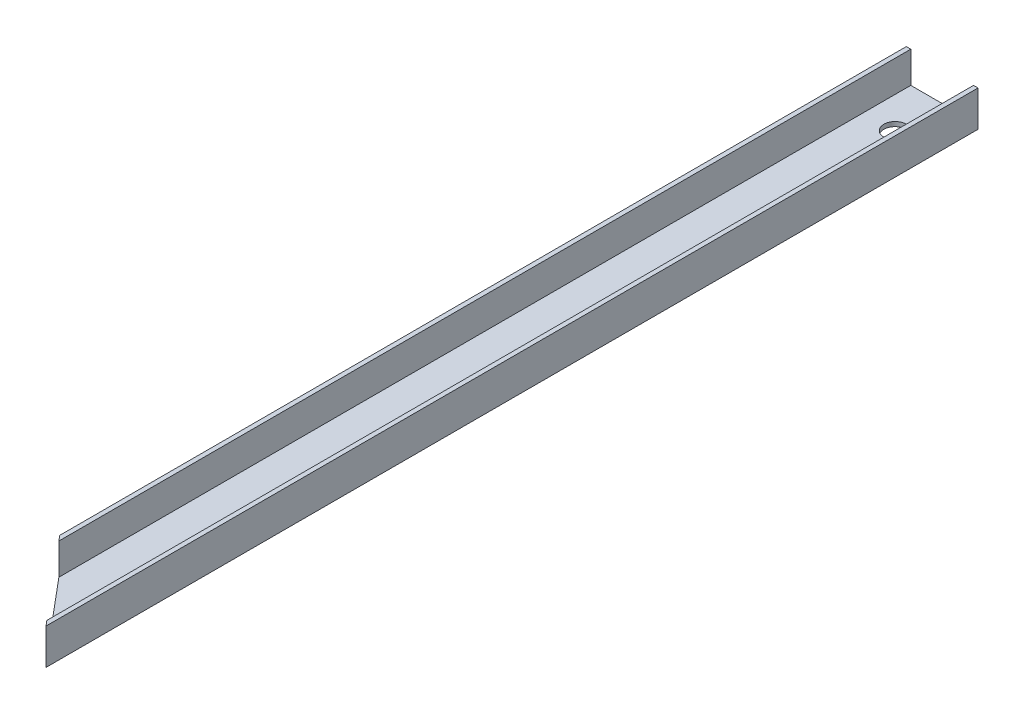
ISO-10303-21;
HEADER;
FILE_DESCRIPTION(('STEP AP214'),'2;1');
FILE_NAME('part.step','',(''),(''),'','','');
FILE_SCHEMA(('AUTOMOTIVE_DESIGN { 1 0 10303 214 1 1 1 1 }'));
ENDSEC;
DATA;
#1=APPLICATION_CONTEXT('core data for automotive mechanical design processes');
#2=APPLICATION_PROTOCOL_DEFINITION('international standard','automotive_design',2000,#1);
#3=PRODUCT_CONTEXT('',#1,'mechanical');
#4=PRODUCT('Part','Part','',(#3));
#5=PRODUCT_RELATED_PRODUCT_CATEGORY('part','',(#4));
#6=PRODUCT_DEFINITION_FORMATION('','',#4);
#7=PRODUCT_DEFINITION_CONTEXT('part definition',#1,'design');
#8=PRODUCT_DEFINITION('design','',#6,#7);
#9=PRODUCT_DEFINITION_SHAPE('','',#8);
#10=(LENGTH_UNIT() NAMED_UNIT(*) SI_UNIT(.MILLI.,.METRE.));
#11=(NAMED_UNIT(*) PLANE_ANGLE_UNIT() SI_UNIT($,.RADIAN.));
#12=(NAMED_UNIT(*) SI_UNIT($,.STERADIAN.) SOLID_ANGLE_UNIT());
#13=UNCERTAINTY_MEASURE_WITH_UNIT(LENGTH_MEASURE(1.E-05),#10,'distance_accuracy_value','');
#14=(GEOMETRIC_REPRESENTATION_CONTEXT(3) GLOBAL_UNCERTAINTY_ASSIGNED_CONTEXT((#13)) GLOBAL_UNIT_ASSIGNED_CONTEXT((#10,
#11,#12)) REPRESENTATION_CONTEXT('',''));
#15=CARTESIAN_POINT('',(0.,0.,0.));
#16=DIRECTION('',(0.,0.,1.));
#17=DIRECTION('',(1.,0.,0.));
#18=AXIS2_PLACEMENT_3D('',#15,#16,#17);
#19=CARTESIAN_POINT('',(-22.225,-9.525,660.4));
#20=DIRECTION('',(0.,-1.,0.));
#21=DIRECTION('',(0.,0.,-1.));
#22=AXIS2_PLACEMENT_3D('',#19,#20,#21);
#23=PLANE('',#22);
#24=CARTESIAN_POINT('',(0.,-9.525,33.3375));
#25=DIRECTION('',(0.,-1.,0.));
#26=DIRECTION('',(0.,0.,-1.));
#27=AXIS2_PLACEMENT_3D('',#24,#25,#26);
#28=CIRCLE('',#27,7.9375);
#29=CARTESIAN_POINT('',(0.,-9.525,25.4));
#30=VERTEX_POINT('',#29);
#31=EDGE_CURVE('E178',#30,#30,#28,.F.);
#32=ORIENTED_EDGE('',*,*,#31,.F.);
#33=EDGE_LOOP('',(#32));
#34=FACE_BOUND('',#33,.T.);
#35=DIRECTION('',(0.,0.,-1.));
#36=VECTOR('',#35,1.);
#37=CARTESIAN_POINT('',(-22.225,-9.525,660.4));
#38=LINE('',#37,#36);
#39=CARTESIAN_POINT('',(-22.225,-9.525,603.642735152701));
#40=VERTEX_POINT('',#39);
#41=CARTESIAN_POINT('',(-22.225,-9.525,0.));
#42=VERTEX_POINT('',#41);
#43=EDGE_CURVE('E11',#40,#42,#38,.T.);
#44=ORIENTED_EDGE('',*,*,#43,.F.);
#45=DIRECTION('',(0.642787609686543,0.,0.766044443118975));
#46=VECTOR('',#45,1.);
#47=CARTESIAN_POINT('',(5.72249723069354,-9.525,636.949265381397));
#48=LINE('',#47,#46);
#49=CARTESIAN_POINT('',(22.225,-9.525,656.616182343513));
#50=VERTEX_POINT('',#49);
#51=EDGE_CURVE('E167',#40,#50,#48,.T.);
#52=ORIENTED_EDGE('',*,*,#51,.T.);
#53=DIRECTION('',(0.,0.,-1.));
#54=VECTOR('',#53,1.);
#55=CARTESIAN_POINT('',(22.225,-9.525,660.4));
#56=LINE('',#55,#54);
#57=CARTESIAN_POINT('',(22.225,-9.525,0.));
#58=VERTEX_POINT('',#57);
#59=EDGE_CURVE('E89',#50,#58,#56,.T.);
#60=ORIENTED_EDGE('',*,*,#59,.T.);
#61=DIRECTION('',(-1.,0.,0.));
#62=VECTOR('',#61,1.);
#63=CARTESIAN_POINT('',(-22.225,-9.525,0.));
#64=LINE('',#63,#62);
#65=EDGE_CURVE('E103',#58,#42,#64,.T.);
#66=ORIENTED_EDGE('',*,*,#65,.T.);
#67=EDGE_LOOP('',(#44,#52,#60,#66));
#68=FACE_BOUND('',#67,.T.);
#69=ADVANCED_FACE('F32',(#34,#68),#23,.F.);
#70=CARTESIAN_POINT('',(-22.225,-9.525,660.4));
#71=DIRECTION('',(-1.,0.,0.));
#72=DIRECTION('',(0.,0.,1.));
#73=AXIS2_PLACEMENT_3D('',#70,#71,#72);
#74=PLANE('',#73);
#75=DIRECTION('',(0.,0.,-1.));
#76=VECTOR('',#75,1.);
#77=CARTESIAN_POINT('',(-22.225,12.7,660.4));
#78=LINE('',#77,#76);
#79=CARTESIAN_POINT('',(-22.225,12.7,603.642735152701));
#80=VERTEX_POINT('',#79);
#81=CARTESIAN_POINT('',(-22.225,12.7,0.));
#82=VERTEX_POINT('',#81);
#83=EDGE_CURVE('E40',#80,#82,#78,.T.);
#84=ORIENTED_EDGE('',*,*,#83,.F.);
#85=DIRECTION('',(0.,-1.,0.));
#86=VECTOR('',#85,1.);
#87=CARTESIAN_POINT('',(-22.225,-9.525,603.642735152701));
#88=LINE('',#87,#86);
#89=EDGE_CURVE('E169',#80,#40,#88,.T.);
#90=ORIENTED_EDGE('',*,*,#89,.T.);
#91=ORIENTED_EDGE('',*,*,#43,.T.);
#92=DIRECTION('',(0.,1.,0.));
#93=VECTOR('',#92,1.);
#94=CARTESIAN_POINT('',(-22.225,-9.525,0.));
#95=LINE('',#94,#93);
#96=EDGE_CURVE('E132',#42,#82,#95,.T.);
#97=ORIENTED_EDGE('',*,*,#96,.T.);
#98=EDGE_LOOP('',(#84,#90,#91,#97));
#99=FACE_BOUND('',#98,.T.);
#100=ADVANCED_FACE('F133',(#99),#74,.F.);
#101=CARTESIAN_POINT('',(-25.4,12.7,660.4));
#102=DIRECTION('',(0.,-1.,0.));
#103=DIRECTION('',(0.,0.,-1.));
#104=AXIS2_PLACEMENT_3D('',#101,#102,#103);
#105=PLANE('',#104);
#106=DIRECTION('',(0.,0.,-1.));
#107=VECTOR('',#106,1.);
#108=CARTESIAN_POINT('',(-25.4,12.7,660.4));
#109=LINE('',#108,#107);
#110=CARTESIAN_POINT('',(-25.4,12.7,599.858917496215));
#111=VERTEX_POINT('',#110);
#112=CARTESIAN_POINT('',(-25.4,12.7,0.));
#113=VERTEX_POINT('',#112);
#114=EDGE_CURVE('E116',#111,#113,#109,.T.);
#115=ORIENTED_EDGE('',*,*,#114,.F.);
#116=DIRECTION('',(0.642787609686543,0.,0.766044443118975));
#117=VECTOR('',#116,1.);
#118=CARTESIAN_POINT('',(25.4,12.7,660.4));
#119=LINE('',#118,#117);
#120=EDGE_CURVE('E129',#111,#80,#119,.T.);
#121=ORIENTED_EDGE('',*,*,#120,.T.);
#122=ORIENTED_EDGE('',*,*,#83,.T.);
#123=DIRECTION('',(-1.,0.,0.));
#124=VECTOR('',#123,1.);
#125=CARTESIAN_POINT('',(-25.4,12.7,0.));
#126=LINE('',#125,#124);
#127=EDGE_CURVE('E125',#82,#113,#126,.T.);
#128=ORIENTED_EDGE('',*,*,#127,.T.);
#129=EDGE_LOOP('',(#115,#121,#122,#128));
#130=FACE_BOUND('',#129,.T.);
#131=ADVANCED_FACE('F123',(#130),#105,.F.);
#132=CARTESIAN_POINT('',(-25.4,-12.7,660.4));
#133=DIRECTION('',(1.,0.,0.));
#134=DIRECTION('',(0.,1.,0.));
#135=AXIS2_PLACEMENT_3D('',#132,#133,#134);
#136=PLANE('',#135);
#137=DIRECTION('',(0.,0.,-1.));
#138=VECTOR('',#137,1.);
#139=CARTESIAN_POINT('',(-25.4,-12.7,660.4));
#140=LINE('',#139,#138);
#141=CARTESIAN_POINT('',(-25.4,-12.7,599.858917496215));
#142=VERTEX_POINT('',#141);
#143=CARTESIAN_POINT('',(-25.4,-12.7,0.));
#144=VERTEX_POINT('',#143);
#145=EDGE_CURVE('E114',#142,#144,#140,.T.);
#146=ORIENTED_EDGE('',*,*,#145,.F.);
#147=DIRECTION('',(0.,-1.,0.));
#148=VECTOR('',#147,1.);
#149=CARTESIAN_POINT('',(-25.4,12.7,599.858917496215));
#150=LINE('',#149,#148);
#151=EDGE_CURVE('E156',#111,#142,#150,.T.);
#152=ORIENTED_EDGE('',*,*,#151,.F.);
#153=ORIENTED_EDGE('',*,*,#114,.T.);
#154=DIRECTION('',(0.,-1.,0.));
#155=VECTOR('',#154,1.);
#156=CARTESIAN_POINT('',(-25.4,-12.7,0.));
#157=LINE('',#156,#155);
#158=EDGE_CURVE('E138',#113,#144,#157,.T.);
#159=ORIENTED_EDGE('',*,*,#158,.T.);
#160=EDGE_LOOP('',(#146,#152,#153,#159));
#161=FACE_BOUND('',#160,.T.);
#162=ADVANCED_FACE('F154',(#161),#136,.F.);
#163=CARTESIAN_POINT('',(-25.4,-12.7,660.4));
#164=DIRECTION('',(0.,1.,0.));
#165=DIRECTION('',(-1.,0.,0.));
#166=AXIS2_PLACEMENT_3D('',#163,#164,#165);
#167=PLANE('',#166);
#168=CARTESIAN_POINT('',(0.,-12.7,33.3375));
#169=DIRECTION('',(0.,-1.,0.));
#170=DIRECTION('',(1.,0.,0.));
#171=AXIS2_PLACEMENT_3D('',#168,#169,#170);
#172=CIRCLE('',#171,7.9375);
#173=CARTESIAN_POINT('',(7.9375,-12.7,33.3375));
#174=VERTEX_POINT('',#173);
#175=EDGE_CURVE('E182',#174,#174,#172,.T.);
#176=ORIENTED_EDGE('',*,*,#175,.F.);
#177=EDGE_LOOP('',(#176));
#178=FACE_BOUND('',#177,.T.);
#179=DIRECTION('',(0.,0.,-1.));
#180=VECTOR('',#179,1.);
#181=CARTESIAN_POINT('',(25.4,-12.7,660.4));
#182=LINE('',#181,#180);
#183=CARTESIAN_POINT('',(25.4,-12.7,660.4));
#184=VERTEX_POINT('',#183);
#185=CARTESIAN_POINT('',(25.4,-12.7,0.));
#186=VERTEX_POINT('',#185);
#187=EDGE_CURVE('E111',#184,#186,#182,.T.);
#188=ORIENTED_EDGE('',*,*,#187,.F.);
#189=DIRECTION('',(0.642787609686543,0.,0.766044443118975));
#190=VECTOR('',#189,1.);
#191=CARTESIAN_POINT('',(25.4,-12.7,660.4));
#192=LINE('',#191,#190);
#193=EDGE_CURVE('E47',#142,#184,#192,.T.);
#194=ORIENTED_EDGE('',*,*,#193,.F.);
#195=ORIENTED_EDGE('',*,*,#145,.T.);
#196=DIRECTION('',(1.,0.,0.));
#197=VECTOR('',#196,1.);
#198=CARTESIAN_POINT('',(-25.4,-12.7,0.));
#199=LINE('',#198,#197);
#200=EDGE_CURVE('E140',#144,#186,#199,.T.);
#201=ORIENTED_EDGE('',*,*,#200,.T.);
#202=EDGE_LOOP('',(#188,#194,#195,#201));
#203=FACE_BOUND('',#202,.T.);
#204=ADVANCED_FACE('F149',(#178,#203),#167,.F.);
#205=CARTESIAN_POINT('',(25.4,-12.7,660.4));
#206=DIRECTION('',(-1.,0.,0.));
#207=DIRECTION('',(0.,0.,1.));
#208=AXIS2_PLACEMENT_3D('',#205,#206,#207);
#209=PLANE('',#208);
#210=DIRECTION('',(0.,1.,0.));
#211=VECTOR('',#210,1.);
#212=CARTESIAN_POINT('',(25.4,-12.7,0.));
#213=LINE('',#212,#211);
#214=CARTESIAN_POINT('',(25.4,12.7,0.));
#215=VERTEX_POINT('',#214);
#216=EDGE_CURVE('E98',#186,#215,#213,.T.);
#217=ORIENTED_EDGE('',*,*,#216,.T.);
#218=DIRECTION('',(0.,0.,-1.));
#219=VECTOR('',#218,1.);
#220=CARTESIAN_POINT('',(25.4,12.7,660.4));
#221=LINE('',#220,#219);
#222=CARTESIAN_POINT('',(25.4,12.7,660.4));
#223=VERTEX_POINT('',#222);
#224=EDGE_CURVE('E88',#223,#215,#221,.T.);
#225=ORIENTED_EDGE('',*,*,#224,.F.);
#226=DIRECTION('',(0.,1.,0.));
#227=VECTOR('',#226,1.);
#228=CARTESIAN_POINT('',(25.4,-12.7,660.4));
#229=LINE('',#228,#227);
#230=EDGE_CURVE('E104',#184,#223,#229,.T.);
#231=ORIENTED_EDGE('',*,*,#230,.F.);
#232=ORIENTED_EDGE('',*,*,#187,.T.);
#233=EDGE_LOOP('',(#217,#225,#231,#232));
#234=FACE_BOUND('',#233,.T.);
#235=ADVANCED_FACE('F145',(#234),#209,.F.);
#236=CARTESIAN_POINT('',(25.4,12.7,660.4));
#237=DIRECTION('',(0.,-1.,0.));
#238=DIRECTION('',(0.,0.,-1.));
#239=AXIS2_PLACEMENT_3D('',#236,#237,#238);
#240=PLANE('',#239);
#241=DIRECTION('',(0.,0.,-1.));
#242=VECTOR('',#241,1.);
#243=CARTESIAN_POINT('',(22.225,12.7,660.4));
#244=LINE('',#243,#242);
#245=CARTESIAN_POINT('',(22.225,12.7,656.616182343513));
#246=VERTEX_POINT('',#245);
#247=CARTESIAN_POINT('',(22.225,12.7,0.));
#248=VERTEX_POINT('',#247);
#249=EDGE_CURVE('E76',#246,#248,#244,.T.);
#250=ORIENTED_EDGE('',*,*,#249,.F.);
#251=EDGE_CURVE('E177',#246,#223,#119,.T.);
#252=ORIENTED_EDGE('',*,*,#251,.T.);
#253=ORIENTED_EDGE('',*,*,#224,.T.);
#254=DIRECTION('',(-1.,0.,0.));
#255=VECTOR('',#254,1.);
#256=CARTESIAN_POINT('',(25.4,12.7,0.));
#257=LINE('',#256,#255);
#258=EDGE_CURVE('E93',#215,#248,#257,.T.);
#259=ORIENTED_EDGE('',*,*,#258,.T.);
#260=EDGE_LOOP('',(#250,#252,#253,#259));
#261=FACE_BOUND('',#260,.T.);
#262=ADVANCED_FACE('F94',(#261),#240,.F.);
#263=CARTESIAN_POINT('',(22.225,-9.525,660.4));
#264=DIRECTION('',(1.,0.,0.));
#265=DIRECTION('',(0.,0.,-1.));
#266=AXIS2_PLACEMENT_3D('',#263,#264,#265);
#267=PLANE('',#266);
#268=ORIENTED_EDGE('',*,*,#59,.F.);
#269=DIRECTION('',(0.,1.,0.));
#270=VECTOR('',#269,1.);
#271=CARTESIAN_POINT('',(22.225,-9.525,656.616182343513));
#272=LINE('',#271,#270);
#273=EDGE_CURVE('E85',#50,#246,#272,.T.);
#274=ORIENTED_EDGE('',*,*,#273,.T.);
#275=ORIENTED_EDGE('',*,*,#249,.T.);
#276=DIRECTION('',(0.,-1.,0.));
#277=VECTOR('',#276,1.);
#278=CARTESIAN_POINT('',(22.225,-9.525,0.));
#279=LINE('',#278,#277);
#280=EDGE_CURVE('E81',#248,#58,#279,.T.);
#281=ORIENTED_EDGE('',*,*,#280,.T.);
#282=EDGE_LOOP('',(#268,#274,#275,#281));
#283=FACE_BOUND('',#282,.T.);
#284=ADVANCED_FACE('F79',(#283),#267,.F.);
#285=CARTESIAN_POINT('',(0.,0.,0.));
#286=DIRECTION('',(0.,0.,1.));
#287=DIRECTION('',(1.,0.,0.));
#288=AXIS2_PLACEMENT_3D('',#285,#286,#287);
#289=PLANE('',#288);
#290=ORIENTED_EDGE('',*,*,#65,.F.);
#291=ORIENTED_EDGE('',*,*,#280,.F.);
#292=ORIENTED_EDGE('',*,*,#258,.F.);
#293=ORIENTED_EDGE('',*,*,#216,.F.);
#294=ORIENTED_EDGE('',*,*,#200,.F.);
#295=ORIENTED_EDGE('',*,*,#158,.F.);
#296=ORIENTED_EDGE('',*,*,#127,.F.);
#297=ORIENTED_EDGE('',*,*,#96,.F.);
#298=EDGE_LOOP('',(#290,#291,#292,#293,#294,#295,#296,#297));
#299=FACE_BOUND('',#298,.T.);
#300=ADVANCED_FACE('F100',(#299),#289,.F.);
#301=CARTESIAN_POINT('',(25.4,12.7,660.4));
#302=DIRECTION('',(0.766044443118975,0.,-0.642787609686543));
#303=DIRECTION('',(-0.642787609686543,0.,-0.766044443118975));
#304=AXIS2_PLACEMENT_3D('',#301,#302,#303);
#305=PLANE('',#304);
#306=ORIENTED_EDGE('',*,*,#120,.F.);
#307=ORIENTED_EDGE('',*,*,#151,.T.);
#308=ORIENTED_EDGE('',*,*,#193,.T.);
#309=ORIENTED_EDGE('',*,*,#230,.T.);
#310=ORIENTED_EDGE('',*,*,#251,.F.);
#311=ORIENTED_EDGE('',*,*,#273,.F.);
#312=ORIENTED_EDGE('',*,*,#51,.F.);
#313=ORIENTED_EDGE('',*,*,#89,.F.);
#314=EDGE_LOOP('',(#306,#307,#308,#309,#310,#311,#312,#313));
#315=FACE_BOUND('',#314,.T.);
#316=ADVANCED_FACE('F168',(#315),#305,.F.);
#317=CARTESIAN_POINT('',(0.,12.701,33.3375));
#318=DIRECTION('',(0.,-1.,0.));
#319=DIRECTION('',(1.,0.,0.));
#320=AXIS2_PLACEMENT_3D('',#317,#318,#319);
#321=CYLINDRICAL_SURFACE('',#320,7.9375);
#322=ORIENTED_EDGE('',*,*,#175,.T.);
#323=EDGE_LOOP('',(#322));
#324=FACE_BOUND('',#323,.T.);
#325=ORIENTED_EDGE('',*,*,#31,.T.);
#326=EDGE_LOOP('',(#325));
#327=FACE_BOUND('',#326,.T.);
#328=ADVANCED_FACE('F186',(#324,#327),#321,.F.);
#329=CLOSED_SHELL('',(#69,#100,#131,#162,#204,#235,#262,#284,#300,#316,#328));
#330=MANIFOLD_SOLID_BREP('B2',#329);
#331=ADVANCED_BREP_SHAPE_REPRESENTATION('',(#18,#330),#14);
#332=SHAPE_DEFINITION_REPRESENTATION(#9,#331);
ENDSEC;
END-ISO-10303-21;
